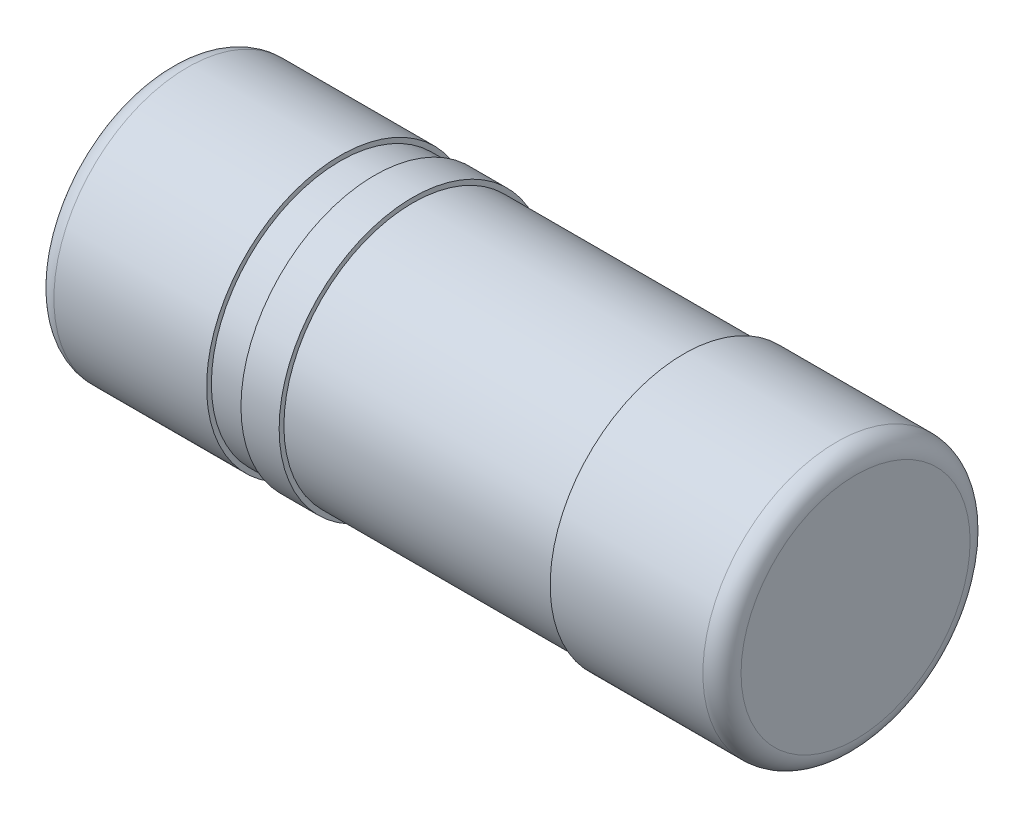
ISO-10303-21;
HEADER;
FILE_DESCRIPTION(('STEP AP214'),'2;1');
FILE_NAME('part.step','',(''),(''),'','','');
FILE_SCHEMA(('AUTOMOTIVE_DESIGN { 1 0 10303 214 1 1 1 1 }'));
ENDSEC;
DATA;
#1=APPLICATION_CONTEXT('core data for automotive mechanical design processes');
#2=APPLICATION_PROTOCOL_DEFINITION('international standard','automotive_design',2000,#1);
#3=PRODUCT_CONTEXT('',#1,'mechanical');
#4=PRODUCT('Part','Part','',(#3));
#5=PRODUCT_RELATED_PRODUCT_CATEGORY('part','',(#4));
#6=PRODUCT_DEFINITION_FORMATION('','',#4);
#7=PRODUCT_DEFINITION_CONTEXT('part definition',#1,'design');
#8=PRODUCT_DEFINITION('design','',#6,#7);
#9=PRODUCT_DEFINITION_SHAPE('','',#8);
#10=(LENGTH_UNIT() NAMED_UNIT(*) SI_UNIT(.MILLI.,.METRE.));
#11=(NAMED_UNIT(*) PLANE_ANGLE_UNIT() SI_UNIT($,.RADIAN.));
#12=(NAMED_UNIT(*) SI_UNIT($,.STERADIAN.) SOLID_ANGLE_UNIT());
#13=UNCERTAINTY_MEASURE_WITH_UNIT(LENGTH_MEASURE(1.E-05),#10,'distance_accuracy_value','');
#14=(GEOMETRIC_REPRESENTATION_CONTEXT(3) GLOBAL_UNCERTAINTY_ASSIGNED_CONTEXT((#13)) GLOBAL_UNIT_ASSIGNED_CONTEXT((#10,
#11,#12)) REPRESENTATION_CONTEXT('',''));
#15=CARTESIAN_POINT('',(0.,0.,0.));
#16=DIRECTION('',(0.,0.,1.));
#17=DIRECTION('',(1.,0.,0.));
#18=AXIS2_PLACEMENT_3D('',#15,#16,#17);
#19=CARTESIAN_POINT('',(-1.8,0.,0.7));
#20=DIRECTION('',(-1.,0.,0.));
#21=DIRECTION('',(0.,0.,1.));
#22=AXIS2_PLACEMENT_3D('',#19,#20,#21);
#23=PLANE('',#22);
#24=CARTESIAN_POINT('',(-1.8,0.,0.7));
#25=DIRECTION('',(1.,0.,0.));
#26=DIRECTION('',(0.,0.,-1.));
#27=AXIS2_PLACEMENT_3D('',#24,#25,#26);
#28=CIRCLE('',#27,0.6);
#29=CARTESIAN_POINT('',(-1.8,0.,0.1));
#30=VERTEX_POINT('',#29);
#31=EDGE_CURVE('E57',#30,#30,#28,.F.);
#32=ORIENTED_EDGE('',*,*,#31,.T.);
#33=EDGE_LOOP('',(#32));
#34=FACE_BOUND('',#33,.T.);
#35=ADVANCED_FACE('F15',(#34),#23,.T.);
#36=CARTESIAN_POINT('',(-1.7,0.,0.7));
#37=DIRECTION('',(1.,0.,0.));
#38=DIRECTION('',(0.,0.,-1.));
#39=AXIS2_PLACEMENT_3D('',#36,#37,#38);
#40=TOROIDAL_SURFACE('',#39,0.6,0.1);
#41=CARTESIAN_POINT('',(-1.7,0.,0.7));
#42=DIRECTION('',(1.,0.,0.));
#43=DIRECTION('',(0.,0.,-1.));
#44=AXIS2_PLACEMENT_3D('',#41,#42,#43);
#45=CIRCLE('',#44,0.7);
#46=CARTESIAN_POINT('',(-1.7,0.,0.));
#47=VERTEX_POINT('',#46);
#48=EDGE_CURVE('E53',#47,#47,#45,.T.);
#49=ORIENTED_EDGE('',*,*,#48,.F.);
#50=EDGE_LOOP('',(#49));
#51=FACE_BOUND('',#50,.T.);
#52=ORIENTED_EDGE('',*,*,#31,.F.);
#53=EDGE_LOOP('',(#52));
#54=FACE_BOUND('',#53,.T.);
#55=ADVANCED_FACE('F71',(#51,#54),#40,.T.);
#56=CARTESIAN_POINT('',(-1.7,0.,0.7));
#57=DIRECTION('',(1.,0.,0.));
#58=DIRECTION('',(0.,0.,-1.));
#59=AXIS2_PLACEMENT_3D('',#56,#57,#58);
#60=CYLINDRICAL_SURFACE('',#59,0.7);
#61=CARTESIAN_POINT('',(-0.9,0.,0.7));
#62=DIRECTION('',(1.,0.,0.));
#63=DIRECTION('',(0.,0.,-1.));
#64=AXIS2_PLACEMENT_3D('',#61,#62,#63);
#65=CIRCLE('',#64,0.7);
#66=CARTESIAN_POINT('',(-0.9,0.,0.));
#67=VERTEX_POINT('',#66);
#68=EDGE_CURVE('E19',#67,#67,#65,.F.);
#69=ORIENTED_EDGE('',*,*,#68,.T.);
#70=EDGE_LOOP('',(#69));
#71=FACE_BOUND('',#70,.T.);
#72=ORIENTED_EDGE('',*,*,#48,.T.);
#73=EDGE_LOOP('',(#72));
#74=FACE_BOUND('',#73,.T.);
#75=ADVANCED_FACE('F75',(#71,#74),#60,.T.);
#76=CARTESIAN_POINT('',(-0.9,0.,0.7));
#77=DIRECTION('',(-1.,0.,0.));
#78=DIRECTION('',(0.,0.,1.));
#79=AXIS2_PLACEMENT_3D('',#76,#77,#78);
#80=PLANE('',#79);
#81=CARTESIAN_POINT('',(-0.9,0.,0.7));
#82=DIRECTION('',(-1.,0.,0.));
#83=DIRECTION('',(0.,0.,1.));
#84=AXIS2_PLACEMENT_3D('',#81,#82,#83);
#85=CIRCLE('',#84,0.675);
#86=CARTESIAN_POINT('',(-0.9,0.,1.375));
#87=VERTEX_POINT('',#86);
#88=EDGE_CURVE('E47',#87,#87,#85,.F.);
#89=ORIENTED_EDGE('',*,*,#88,.F.);
#90=EDGE_LOOP('',(#89));
#91=FACE_BOUND('',#90,.T.);
#92=ORIENTED_EDGE('',*,*,#68,.F.);
#93=EDGE_LOOP('',(#92));
#94=FACE_BOUND('',#93,.T.);
#95=ADVANCED_FACE('F79',(#91,#94),#80,.F.);
#96=CARTESIAN_POINT('',(1.8,0.,0.7));
#97=DIRECTION('',(-1.,0.,0.));
#98=DIRECTION('',(0.,0.,1.));
#99=AXIS2_PLACEMENT_3D('',#96,#97,#98);
#100=PLANE('',#99);
#101=CARTESIAN_POINT('',(1.8,0.,0.7));
#102=DIRECTION('',(-1.,0.,0.));
#103=DIRECTION('',(0.,0.,-1.));
#104=AXIS2_PLACEMENT_3D('',#101,#102,#103);
#105=CIRCLE('',#104,0.6);
#106=CARTESIAN_POINT('',(1.8,0.,0.1));
#107=VERTEX_POINT('',#106);
#108=EDGE_CURVE('E46',#107,#107,#105,.F.);
#109=ORIENTED_EDGE('',*,*,#108,.T.);
#110=EDGE_LOOP('',(#109));
#111=FACE_BOUND('',#110,.T.);
#112=ADVANCED_FACE('F82',(#111),#100,.F.);
#113=CARTESIAN_POINT('',(1.35,0.,0.7));
#114=DIRECTION('',(-1.,0.,0.));
#115=DIRECTION('',(0.,0.,1.));
#116=AXIS2_PLACEMENT_3D('',#113,#114,#115);
#117=CYLINDRICAL_SURFACE('',#116,0.675);
#118=ORIENTED_EDGE('',*,*,#88,.T.);
#119=EDGE_LOOP('',(#118));
#120=FACE_BOUND('',#119,.T.);
#121=CARTESIAN_POINT('',(-0.72,0.,0.7));
#122=DIRECTION('',(-1.,0.,0.));
#123=DIRECTION('',(0.,0.,1.));
#124=AXIS2_PLACEMENT_3D('',#121,#122,#123);
#125=CIRCLE('',#124,0.675);
#126=CARTESIAN_POINT('',(-0.72,0.,1.375));
#127=VERTEX_POINT('',#126);
#128=EDGE_CURVE('E44',#127,#127,#125,.F.);
#129=ORIENTED_EDGE('',*,*,#128,.F.);
#130=EDGE_LOOP('',(#129));
#131=FACE_BOUND('',#130,.T.);
#132=ADVANCED_FACE('F87',(#120,#131),#117,.T.);
#133=CARTESIAN_POINT('',(1.7,0.,0.7));
#134=DIRECTION('',(1.,0.,0.));
#135=DIRECTION('',(0.,0.,-1.));
#136=AXIS2_PLACEMENT_3D('',#133,#134,#135);
#137=TOROIDAL_SURFACE('',#136,0.6,0.1);
#138=ORIENTED_EDGE('',*,*,#108,.F.);
#139=EDGE_LOOP('',(#138));
#140=FACE_BOUND('',#139,.T.);
#141=CARTESIAN_POINT('',(1.7,0.,0.7));
#142=DIRECTION('',(1.,0.,0.));
#143=DIRECTION('',(0.,0.,-1.));
#144=AXIS2_PLACEMENT_3D('',#141,#142,#143);
#145=CIRCLE('',#144,0.7);
#146=CARTESIAN_POINT('',(1.7,0.,0.));
#147=VERTEX_POINT('',#146);
#148=EDGE_CURVE('E43',#147,#147,#145,.F.);
#149=ORIENTED_EDGE('',*,*,#148,.F.);
#150=EDGE_LOOP('',(#149));
#151=FACE_BOUND('',#150,.T.);
#152=ADVANCED_FACE('F101',(#140,#151),#137,.T.);
#153=CARTESIAN_POINT('',(-0.72,0.,0.7));
#154=DIRECTION('',(-1.,0.,0.));
#155=DIRECTION('',(0.,0.,1.));
#156=AXIS2_PLACEMENT_3D('',#153,#154,#155);
#157=PLANE('',#156);
#158=ORIENTED_EDGE('',*,*,#128,.T.);
#159=EDGE_LOOP('',(#158));
#160=FACE_BOUND('',#159,.T.);
#161=CARTESIAN_POINT('',(-0.72,0.,0.7));
#162=DIRECTION('',(-1.,0.,0.));
#163=DIRECTION('',(0.,0.,1.));
#164=AXIS2_PLACEMENT_3D('',#161,#162,#163);
#165=CIRCLE('',#164,0.7);
#166=CARTESIAN_POINT('',(-0.72,0.,1.4));
#167=VERTEX_POINT('',#166);
#168=EDGE_CURVE('E40',#167,#167,#165,.F.);
#169=ORIENTED_EDGE('',*,*,#168,.F.);
#170=EDGE_LOOP('',(#169));
#171=FACE_BOUND('',#170,.T.);
#172=ADVANCED_FACE('F104',(#160,#171),#157,.T.);
#173=CARTESIAN_POINT('',(0.9,0.,0.7));
#174=DIRECTION('',(1.,0.,0.));
#175=DIRECTION('',(0.,0.,-1.));
#176=AXIS2_PLACEMENT_3D('',#173,#174,#175);
#177=CYLINDRICAL_SURFACE('',#176,0.7);
#178=ORIENTED_EDGE('',*,*,#148,.T.);
#179=EDGE_LOOP('',(#178));
#180=FACE_BOUND('',#179,.T.);
#181=CARTESIAN_POINT('',(0.9,0.,0.7));
#182=DIRECTION('',(1.,0.,0.));
#183=DIRECTION('',(0.,0.,-1.));
#184=AXIS2_PLACEMENT_3D('',#181,#182,#183);
#185=CIRCLE('',#184,0.7);
#186=CARTESIAN_POINT('',(0.9,0.,0.));
#187=VERTEX_POINT('',#186);
#188=EDGE_CURVE('E37',#187,#187,#185,.F.);
#189=ORIENTED_EDGE('',*,*,#188,.F.);
#190=EDGE_LOOP('',(#189));
#191=FACE_BOUND('',#190,.T.);
#192=ADVANCED_FACE('F114',(#180,#191),#177,.T.);
#193=CARTESIAN_POINT('',(-0.52,0.,0.7));
#194=DIRECTION('',(-1.,0.,0.));
#195=DIRECTION('',(0.,0.,1.));
#196=AXIS2_PLACEMENT_3D('',#193,#194,#195);
#197=CYLINDRICAL_SURFACE('',#196,0.7);
#198=ORIENTED_EDGE('',*,*,#168,.T.);
#199=EDGE_LOOP('',(#198));
#200=FACE_BOUND('',#199,.T.);
#201=CARTESIAN_POINT('',(-0.52,0.,0.7));
#202=DIRECTION('',(-1.,0.,0.));
#203=DIRECTION('',(0.,0.,1.));
#204=AXIS2_PLACEMENT_3D('',#201,#202,#203);
#205=CIRCLE('',#204,0.7);
#206=CARTESIAN_POINT('',(-0.52,0.,1.4));
#207=VERTEX_POINT('',#206);
#208=EDGE_CURVE('E28',#207,#207,#205,.F.);
#209=ORIENTED_EDGE('',*,*,#208,.F.);
#210=EDGE_LOOP('',(#209));
#211=FACE_BOUND('',#210,.T.);
#212=ADVANCED_FACE('F118',(#200,#211),#197,.T.);
#213=CARTESIAN_POINT('',(0.9,0.,0.7));
#214=DIRECTION('',(-1.,0.,0.));
#215=DIRECTION('',(0.,0.,1.));
#216=AXIS2_PLACEMENT_3D('',#213,#214,#215);
#217=PLANE('',#216);
#218=CARTESIAN_POINT('',(0.9,0.,0.7));
#219=DIRECTION('',(-1.,0.,0.));
#220=DIRECTION('',(0.,0.,1.));
#221=AXIS2_PLACEMENT_3D('',#218,#219,#220);
#222=CIRCLE('',#221,0.675);
#223=CARTESIAN_POINT('',(0.9,0.,1.375));
#224=VERTEX_POINT('',#223);
#225=EDGE_CURVE('E23',#224,#224,#222,.T.);
#226=ORIENTED_EDGE('',*,*,#225,.F.);
#227=EDGE_LOOP('',(#226));
#228=FACE_BOUND('',#227,.T.);
#229=ORIENTED_EDGE('',*,*,#188,.T.);
#230=EDGE_LOOP('',(#229));
#231=FACE_BOUND('',#230,.T.);
#232=ADVANCED_FACE('F121',(#228,#231),#217,.T.);
#233=CARTESIAN_POINT('',(-0.52,0.,0.7));
#234=DIRECTION('',(1.,0.,0.));
#235=DIRECTION('',(0.,0.,-1.));
#236=AXIS2_PLACEMENT_3D('',#233,#234,#235);
#237=PLANE('',#236);
#238=CARTESIAN_POINT('',(-0.52,0.,0.7));
#239=DIRECTION('',(-1.,0.,0.));
#240=DIRECTION('',(0.,0.,1.));
#241=AXIS2_PLACEMENT_3D('',#238,#239,#240);
#242=CIRCLE('',#241,0.675);
#243=CARTESIAN_POINT('',(-0.52,0.,1.375));
#244=VERTEX_POINT('',#243);
#245=EDGE_CURVE('E10',#244,#244,#242,.F.);
#246=ORIENTED_EDGE('',*,*,#245,.F.);
#247=EDGE_LOOP('',(#246));
#248=FACE_BOUND('',#247,.T.);
#249=ORIENTED_EDGE('',*,*,#208,.T.);
#250=EDGE_LOOP('',(#249));
#251=FACE_BOUND('',#250,.T.);
#252=ADVANCED_FACE('F125',(#248,#251),#237,.T.);
#253=CARTESIAN_POINT('',(1.35,0.,0.7));
#254=DIRECTION('',(-1.,0.,0.));
#255=DIRECTION('',(0.,0.,1.));
#256=AXIS2_PLACEMENT_3D('',#253,#254,#255);
#257=CYLINDRICAL_SURFACE('',#256,0.675);
#258=ORIENTED_EDGE('',*,*,#245,.T.);
#259=EDGE_LOOP('',(#258));
#260=FACE_BOUND('',#259,.T.);
#261=ORIENTED_EDGE('',*,*,#225,.T.);
#262=EDGE_LOOP('',(#261));
#263=FACE_BOUND('',#262,.T.);
#264=ADVANCED_FACE('F129',(#260,#263),#257,.T.);
#265=CLOSED_SHELL('',(#35,#55,#75,#95,#112,#132,#152,#172,#192,#212,#232,#252,#264));
#266=MANIFOLD_SOLID_BREP('B1',#265);
#267=ADVANCED_BREP_SHAPE_REPRESENTATION('',(#18,#266),#14);
#268=SHAPE_DEFINITION_REPRESENTATION(#9,#267);
ENDSEC;
END-ISO-10303-21;
